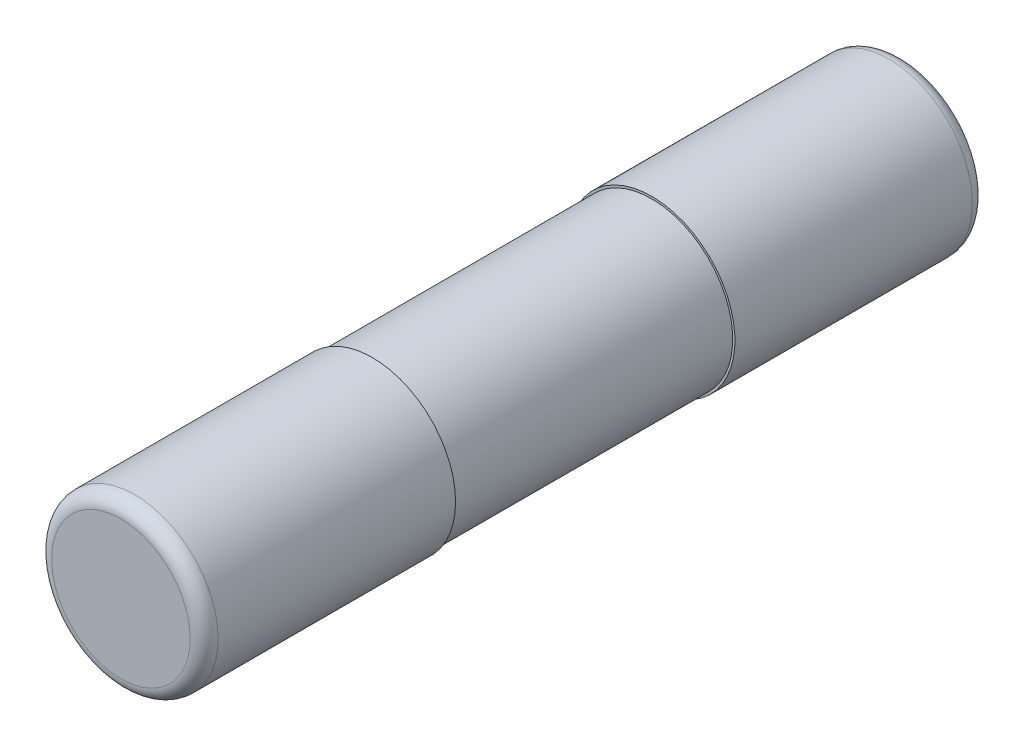
ISO-10303-21;
HEADER;
FILE_DESCRIPTION(('STEP AP214'),'2;1');
FILE_NAME('part.step','',(''),(''),'','','');
FILE_SCHEMA(('AUTOMOTIVE_DESIGN { 1 0 10303 214 1 1 1 1 }'));
ENDSEC;
DATA;
#1=APPLICATION_CONTEXT('core data for automotive mechanical design processes');
#2=APPLICATION_PROTOCOL_DEFINITION('international standard','automotive_design',2000,#1);
#3=PRODUCT_CONTEXT('',#1,'mechanical');
#4=PRODUCT('Part','Part','',(#3));
#5=PRODUCT_RELATED_PRODUCT_CATEGORY('part','',(#4));
#6=PRODUCT_DEFINITION_FORMATION('','',#4);
#7=PRODUCT_DEFINITION_CONTEXT('part definition',#1,'design');
#8=PRODUCT_DEFINITION('design','',#6,#7);
#9=PRODUCT_DEFINITION_SHAPE('','',#8);
#10=(LENGTH_UNIT() NAMED_UNIT(*) SI_UNIT(.MILLI.,.METRE.));
#11=(NAMED_UNIT(*) PLANE_ANGLE_UNIT() SI_UNIT($,.RADIAN.));
#12=(NAMED_UNIT(*) SI_UNIT($,.STERADIAN.) SOLID_ANGLE_UNIT());
#13=UNCERTAINTY_MEASURE_WITH_UNIT(LENGTH_MEASURE(1.E-05),#10,'distance_accuracy_value','');
#14=(GEOMETRIC_REPRESENTATION_CONTEXT(3) GLOBAL_UNCERTAINTY_ASSIGNED_CONTEXT((#13)) GLOBAL_UNIT_ASSIGNED_CONTEXT((#10,
#11,#12)) REPRESENTATION_CONTEXT('',''));
#15=CARTESIAN_POINT('',(0.,0.,0.));
#16=DIRECTION('',(0.,0.,1.));
#17=DIRECTION('',(1.,0.,0.));
#18=AXIS2_PLACEMENT_3D('',#15,#16,#17);
#19=CARTESIAN_POINT('',(0.,0.,5.));
#20=DIRECTION('',(0.,0.,-1.));
#21=DIRECTION('',(-1.,0.,0.));
#22=AXIS2_PLACEMENT_3D('',#19,#20,#21);
#23=CYLINDRICAL_SURFACE('',#22,1.45);
#24=CARTESIAN_POINT('',(0.,0.,5.));
#25=DIRECTION('',(0.,0.,1.));
#26=DIRECTION('',(1.,0.,0.));
#27=AXIS2_PLACEMENT_3D('',#24,#25,#26);
#28=CIRCLE('',#27,1.45);
#29=CARTESIAN_POINT('',(1.45,0.,5.));
#30=VERTEX_POINT('',#29);
#31=EDGE_CURVE('E51',#30,#30,#28,.T.);
#32=ORIENTED_EDGE('',*,*,#31,.F.);
#33=EDGE_LOOP('',(#32));
#34=FACE_BOUND('',#33,.T.);
#35=CARTESIAN_POINT('',(0.,0.,0.));
#36=DIRECTION('',(0.,0.,-1.));
#37=DIRECTION('',(-1.,0.,0.));
#38=AXIS2_PLACEMENT_3D('',#35,#36,#37);
#39=CIRCLE('',#38,1.45);
#40=CARTESIAN_POINT('',(-1.45,0.,0.));
#41=VERTEX_POINT('',#40);
#42=EDGE_CURVE('E57',#41,#41,#39,.T.);
#43=ORIENTED_EDGE('',*,*,#42,.F.);
#44=EDGE_LOOP('',(#43));
#45=FACE_BOUND('',#44,.T.);
#46=ADVANCED_FACE('F31',(#34,#45),#23,.T.);
#47=CARTESIAN_POINT('',(0.,0.,9.5));
#48=DIRECTION('',(0.,0.,-1.));
#49=DIRECTION('',(-1.,0.,0.));
#50=AXIS2_PLACEMENT_3D('',#47,#48,#49);
#51=CYLINDRICAL_SURFACE('',#50,1.49);
#52=CARTESIAN_POINT('',(0.,0.,9.25));
#53=DIRECTION('',(0.,0.,1.));
#54=DIRECTION('',(1.,0.,0.));
#55=AXIS2_PLACEMENT_3D('',#52,#53,#54);
#56=CIRCLE('',#55,1.49);
#57=CARTESIAN_POINT('',(1.49,0.,9.25));
#58=VERTEX_POINT('',#57);
#59=EDGE_CURVE('E42',#58,#58,#56,.F.);
#60=ORIENTED_EDGE('',*,*,#59,.T.);
#61=EDGE_LOOP('',(#60));
#62=FACE_BOUND('',#61,.T.);
#63=CARTESIAN_POINT('',(0.,0.,5.));
#64=DIRECTION('',(0.,0.,1.));
#65=DIRECTION('',(1.,0.,0.));
#66=AXIS2_PLACEMENT_3D('',#63,#64,#65);
#67=CIRCLE('',#66,1.49);
#68=CARTESIAN_POINT('',(1.49,0.,5.));
#69=VERTEX_POINT('',#68);
#70=EDGE_CURVE('E54',#69,#69,#67,.T.);
#71=ORIENTED_EDGE('',*,*,#70,.T.);
#72=EDGE_LOOP('',(#71));
#73=FACE_BOUND('',#72,.T.);
#74=ADVANCED_FACE('F80',(#62,#73),#51,.T.);
#75=CARTESIAN_POINT('',(0.,0.,9.5));
#76=DIRECTION('',(0.,0.,1.));
#77=DIRECTION('',(1.,0.,0.));
#78=AXIS2_PLACEMENT_3D('',#75,#76,#77);
#79=PLANE('',#78);
#80=CARTESIAN_POINT('',(0.,0.,9.5));
#81=DIRECTION('',(0.,0.,1.));
#82=DIRECTION('',(1.,0.,0.));
#83=AXIS2_PLACEMENT_3D('',#80,#81,#82);
#84=CIRCLE('',#83,1.24);
#85=CARTESIAN_POINT('',(1.24,0.,9.5));
#86=VERTEX_POINT('',#85);
#87=EDGE_CURVE('E46',#86,#86,#84,.T.);
#88=ORIENTED_EDGE('',*,*,#87,.T.);
#89=EDGE_LOOP('',(#88));
#90=FACE_BOUND('',#89,.T.);
#91=ADVANCED_FACE('F86',(#90),#79,.T.);
#92=CARTESIAN_POINT('',(0.,0.,5.));
#93=DIRECTION('',(0.,0.,1.));
#94=DIRECTION('',(1.,0.,0.));
#95=AXIS2_PLACEMENT_3D('',#92,#93,#94);
#96=PLANE('',#95);
#97=ORIENTED_EDGE('',*,*,#31,.T.);
#98=EDGE_LOOP('',(#97));
#99=FACE_BOUND('',#98,.T.);
#100=ORIENTED_EDGE('',*,*,#70,.F.);
#101=EDGE_LOOP('',(#100));
#102=FACE_BOUND('',#101,.T.);
#103=ADVANCED_FACE('F92',(#99,#102),#96,.F.);
#104=CARTESIAN_POINT('',(0.,0.,-4.5));
#105=DIRECTION('',(0.,0.,1.));
#106=DIRECTION('',(1.,0.,0.));
#107=AXIS2_PLACEMENT_3D('',#104,#105,#106);
#108=CYLINDRICAL_SURFACE('',#107,1.49);
#109=CARTESIAN_POINT('',(0.,0.,-4.25));
#110=DIRECTION('',(0.,0.,-1.));
#111=DIRECTION('',(-1.,0.,0.));
#112=AXIS2_PLACEMENT_3D('',#109,#110,#111);
#113=CIRCLE('',#112,1.49);
#114=CARTESIAN_POINT('',(-1.49,0.,-4.25));
#115=VERTEX_POINT('',#114);
#116=EDGE_CURVE('E10',#115,#115,#113,.F.);
#117=ORIENTED_EDGE('',*,*,#116,.T.);
#118=EDGE_LOOP('',(#117));
#119=FACE_BOUND('',#118,.T.);
#120=CARTESIAN_POINT('',(0.,0.,0.));
#121=DIRECTION('',(0.,0.,-1.));
#122=DIRECTION('',(-1.,0.,0.));
#123=AXIS2_PLACEMENT_3D('',#120,#121,#122);
#124=CIRCLE('',#123,1.49);
#125=CARTESIAN_POINT('',(-1.49,0.,0.));
#126=VERTEX_POINT('',#125);
#127=EDGE_CURVE('E60',#126,#126,#124,.T.);
#128=ORIENTED_EDGE('',*,*,#127,.T.);
#129=EDGE_LOOP('',(#128));
#130=FACE_BOUND('',#129,.T.);
#131=ADVANCED_FACE('F64',(#119,#130),#108,.T.);
#132=CARTESIAN_POINT('',(0.,0.,-4.5));
#133=DIRECTION('',(0.,0.,-1.));
#134=DIRECTION('',(-1.,0.,0.));
#135=AXIS2_PLACEMENT_3D('',#132,#133,#134);
#136=PLANE('',#135);
#137=CARTESIAN_POINT('',(0.,0.,-4.5));
#138=DIRECTION('',(0.,0.,-1.));
#139=DIRECTION('',(-1.,0.,0.));
#140=AXIS2_PLACEMENT_3D('',#137,#138,#139);
#141=CIRCLE('',#140,1.24);
#142=CARTESIAN_POINT('',(-1.24,0.,-4.5));
#143=VERTEX_POINT('',#142);
#144=EDGE_CURVE('E38',#143,#143,#141,.T.);
#145=ORIENTED_EDGE('',*,*,#144,.T.);
#146=EDGE_LOOP('',(#145));
#147=FACE_BOUND('',#146,.T.);
#148=ADVANCED_FACE('F69',(#147),#136,.T.);
#149=CARTESIAN_POINT('',(0.,0.,0.));
#150=DIRECTION('',(0.,0.,-1.));
#151=DIRECTION('',(-1.,0.,0.));
#152=AXIS2_PLACEMENT_3D('',#149,#150,#151);
#153=PLANE('',#152);
#154=ORIENTED_EDGE('',*,*,#42,.T.);
#155=EDGE_LOOP('',(#154));
#156=FACE_BOUND('',#155,.T.);
#157=ORIENTED_EDGE('',*,*,#127,.F.);
#158=EDGE_LOOP('',(#157));
#159=FACE_BOUND('',#158,.T.);
#160=ADVANCED_FACE('F66',(#156,#159),#153,.F.);
#161=CARTESIAN_POINT('',(0.,0.,9.25));
#162=DIRECTION('',(0.,0.,1.));
#163=DIRECTION('',(1.,0.,0.));
#164=AXIS2_PLACEMENT_3D('',#161,#162,#163);
#165=TOROIDAL_SURFACE('',#164,1.24,0.25);
#166=ORIENTED_EDGE('',*,*,#59,.F.);
#167=EDGE_LOOP('',(#166));
#168=FACE_BOUND('',#167,.T.);
#169=ORIENTED_EDGE('',*,*,#87,.F.);
#170=EDGE_LOOP('',(#169));
#171=FACE_BOUND('',#170,.T.);
#172=ADVANCED_FACE('F68',(#168,#171),#165,.T.);
#173=CARTESIAN_POINT('',(0.,0.,-4.25));
#174=DIRECTION('',(0.,0.,-1.));
#175=DIRECTION('',(-1.,0.,0.));
#176=AXIS2_PLACEMENT_3D('',#173,#174,#175);
#177=TOROIDAL_SURFACE('',#176,1.24,0.25);
#178=ORIENTED_EDGE('',*,*,#116,.F.);
#179=EDGE_LOOP('',(#178));
#180=FACE_BOUND('',#179,.T.);
#181=ORIENTED_EDGE('',*,*,#144,.F.);
#182=EDGE_LOOP('',(#181));
#183=FACE_BOUND('',#182,.T.);
#184=ADVANCED_FACE('F33',(#180,#183),#177,.T.);
#185=CLOSED_SHELL('',(#46,#74,#91,#103,#131,#148,#160,#172,#184));
#186=MANIFOLD_SOLID_BREP('B2',#185);
#187=ADVANCED_BREP_SHAPE_REPRESENTATION('',(#18,#186),#14);
#188=SHAPE_DEFINITION_REPRESENTATION(#9,#187);
ENDSEC;
END-ISO-10303-21;
